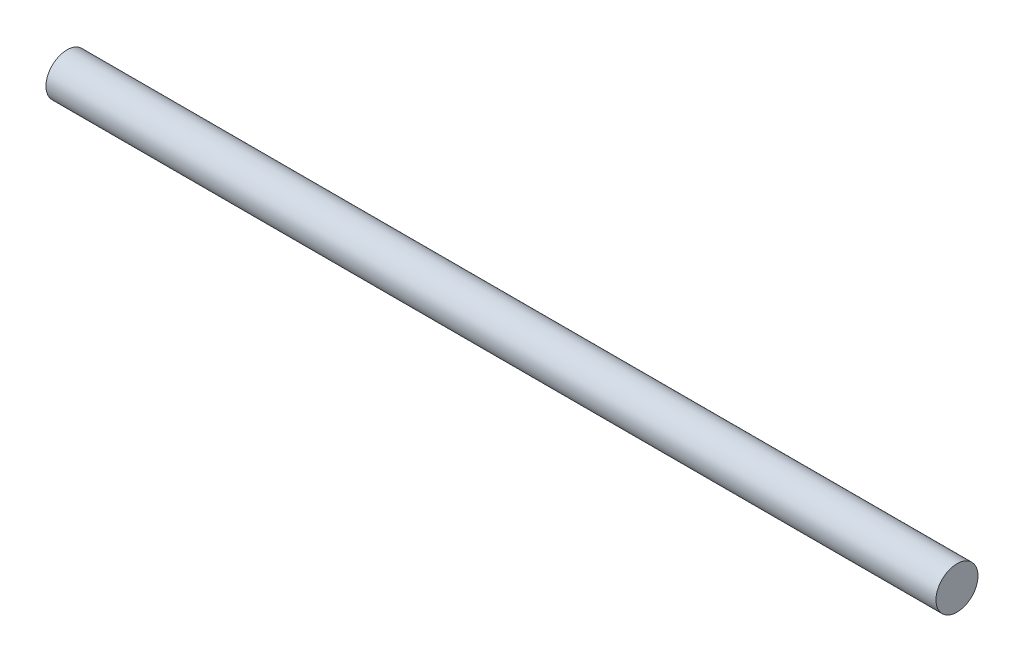
ISO-10303-21;
HEADER;
FILE_DESCRIPTION(('STEP AP214'),'2;1');
FILE_NAME('part.step','',(''),(''),'','','');
FILE_SCHEMA(('AUTOMOTIVE_DESIGN { 1 0 10303 214 1 1 1 1 }'));
ENDSEC;
DATA;
#1=APPLICATION_CONTEXT('core data for automotive mechanical design processes');
#2=APPLICATION_PROTOCOL_DEFINITION('international standard','automotive_design',2000,#1);
#3=PRODUCT_CONTEXT('',#1,'mechanical');
#4=PRODUCT('Part','Part','',(#3));
#5=PRODUCT_RELATED_PRODUCT_CATEGORY('part','',(#4));
#6=PRODUCT_DEFINITION_FORMATION('','',#4);
#7=PRODUCT_DEFINITION_CONTEXT('part definition',#1,'design');
#8=PRODUCT_DEFINITION('design','',#6,#7);
#9=PRODUCT_DEFINITION_SHAPE('','',#8);
#10=(LENGTH_UNIT() NAMED_UNIT(*) SI_UNIT(.MILLI.,.METRE.));
#11=(NAMED_UNIT(*) PLANE_ANGLE_UNIT() SI_UNIT($,.RADIAN.));
#12=(NAMED_UNIT(*) SI_UNIT($,.STERADIAN.) SOLID_ANGLE_UNIT());
#13=UNCERTAINTY_MEASURE_WITH_UNIT(LENGTH_MEASURE(1.E-05),#10,'distance_accuracy_value','');
#14=(GEOMETRIC_REPRESENTATION_CONTEXT(3) GLOBAL_UNCERTAINTY_ASSIGNED_CONTEXT((#13)) GLOBAL_UNIT_ASSIGNED_CONTEXT((#10,
#11,#12)) REPRESENTATION_CONTEXT('',''));
#15=CARTESIAN_POINT('',(0.,0.,0.));
#16=DIRECTION('',(0.,0.,1.));
#17=DIRECTION('',(1.,0.,0.));
#18=AXIS2_PLACEMENT_3D('',#15,#16,#17);
#19=CARTESIAN_POINT('',(12.37,0.,0.));
#20=DIRECTION('',(-1.,0.,0.));
#21=DIRECTION('',(0.,0.,1.));
#22=AXIS2_PLACEMENT_3D('',#19,#20,#21);
#23=CYLINDRICAL_SURFACE('',#22,0.2921);
#24=CARTESIAN_POINT('',(12.37,0.,0.));
#25=DIRECTION('',(1.,0.,0.));
#26=DIRECTION('',(0.,0.,-1.));
#27=AXIS2_PLACEMENT_3D('',#24,#25,#26);
#28=CIRCLE('',#27,0.2921);
#29=CARTESIAN_POINT('',(12.37,0.,-0.2921));
#30=VERTEX_POINT('',#29);
#31=EDGE_CURVE('E10',#30,#30,#28,.T.);
#32=ORIENTED_EDGE('',*,*,#31,.F.);
#33=EDGE_LOOP('',(#32));
#34=FACE_BOUND('',#33,.T.);
#35=CARTESIAN_POINT('',(0.,0.,0.));
#36=DIRECTION('',(1.,0.,0.));
#37=DIRECTION('',(0.,0.,-1.));
#38=AXIS2_PLACEMENT_3D('',#35,#36,#37);
#39=CIRCLE('',#38,0.2921);
#40=CARTESIAN_POINT('',(0.,0.,-0.2921));
#41=VERTEX_POINT('',#40);
#42=EDGE_CURVE('E34',#41,#41,#39,.T.);
#43=ORIENTED_EDGE('',*,*,#42,.T.);
#44=EDGE_LOOP('',(#43));
#45=FACE_BOUND('',#44,.T.);
#46=ADVANCED_FACE('F31',(#34,#45),#23,.T.);
#47=CARTESIAN_POINT('',(12.37,0.,0.));
#48=DIRECTION('',(1.,0.,0.));
#49=DIRECTION('',(0.,0.,-1.));
#50=AXIS2_PLACEMENT_3D('',#47,#48,#49);
#51=PLANE('',#50);
#52=ORIENTED_EDGE('',*,*,#31,.T.);
#53=EDGE_LOOP('',(#52));
#54=FACE_BOUND('',#53,.T.);
#55=ADVANCED_FACE('F46',(#54),#51,.T.);
#56=CARTESIAN_POINT('',(0.,0.,0.));
#57=DIRECTION('',(1.,0.,0.));
#58=DIRECTION('',(0.,0.,-1.));
#59=AXIS2_PLACEMENT_3D('',#56,#57,#58);
#60=PLANE('',#59);
#61=ORIENTED_EDGE('',*,*,#42,.F.);
#62=EDGE_LOOP('',(#61));
#63=FACE_BOUND('',#62,.T.);
#64=ADVANCED_FACE('F44',(#63),#60,.F.);
#65=CLOSED_SHELL('',(#46,#55,#64));
#66=MANIFOLD_SOLID_BREP('B2',#65);
#67=ADVANCED_BREP_SHAPE_REPRESENTATION('',(#18,#66),#14);
#68=SHAPE_DEFINITION_REPRESENTATION(#9,#67);
ENDSEC;
END-ISO-10303-21;
